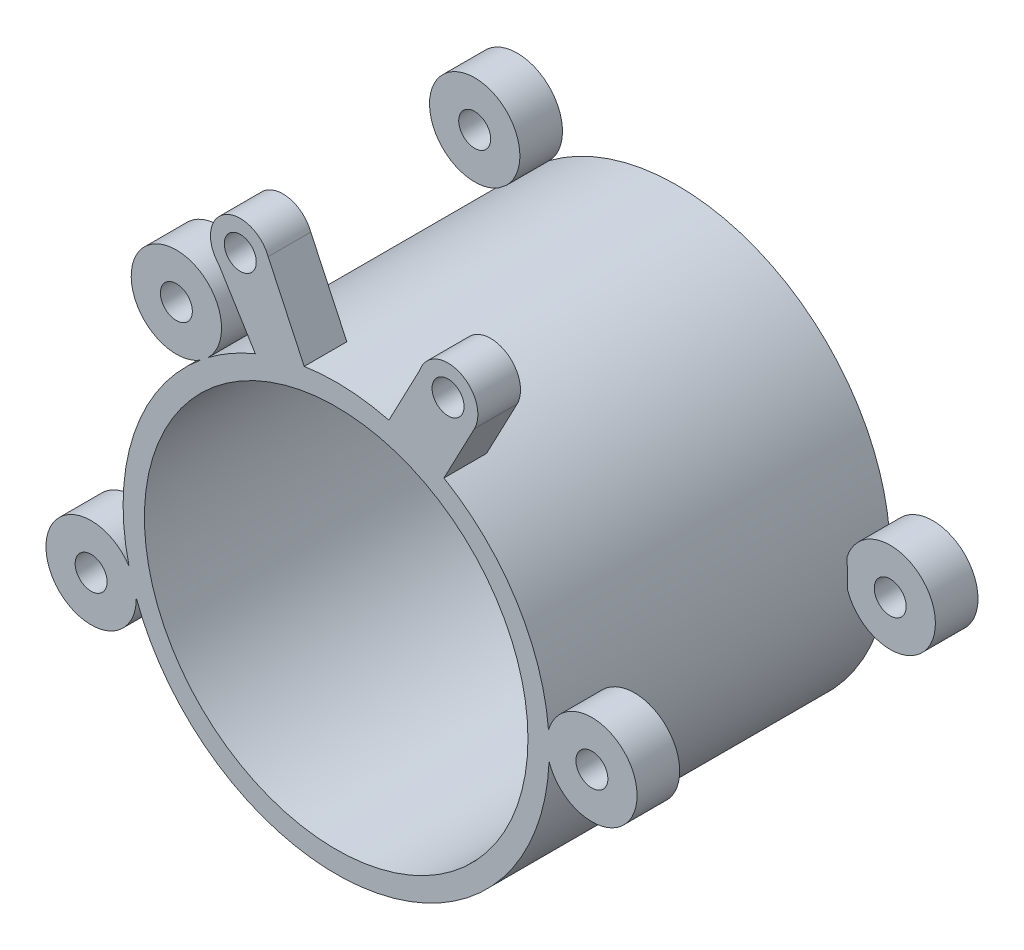
ISO-10303-21;
HEADER;
FILE_DESCRIPTION(('STEP AP214'),'2;1');
FILE_NAME('part.step','',(''),(''),'','','');
FILE_SCHEMA(('AUTOMOTIVE_DESIGN { 1 0 10303 214 1 1 1 1 }'));
ENDSEC;
DATA;
#1=APPLICATION_CONTEXT('core data for automotive mechanical design processes');
#2=APPLICATION_PROTOCOL_DEFINITION('international standard','automotive_design',2000,#1);
#3=PRODUCT_CONTEXT('',#1,'mechanical');
#4=PRODUCT('Part','Part','',(#3));
#5=PRODUCT_RELATED_PRODUCT_CATEGORY('part','',(#4));
#6=PRODUCT_DEFINITION_FORMATION('','',#4);
#7=PRODUCT_DEFINITION_CONTEXT('part definition',#1,'design');
#8=PRODUCT_DEFINITION('design','',#6,#7);
#9=PRODUCT_DEFINITION_SHAPE('','',#8);
#10=(LENGTH_UNIT() NAMED_UNIT(*) SI_UNIT(.MILLI.,.METRE.));
#11=(NAMED_UNIT(*) PLANE_ANGLE_UNIT() SI_UNIT($,.RADIAN.));
#12=(NAMED_UNIT(*) SI_UNIT($,.STERADIAN.) SOLID_ANGLE_UNIT());
#13=UNCERTAINTY_MEASURE_WITH_UNIT(LENGTH_MEASURE(1.E-05),#10,'distance_accuracy_value','');
#14=(GEOMETRIC_REPRESENTATION_CONTEXT(3) GLOBAL_UNCERTAINTY_ASSIGNED_CONTEXT((#13)) GLOBAL_UNIT_ASSIGNED_CONTEXT((#10,
#11,#12)) REPRESENTATION_CONTEXT('',''));
#15=CARTESIAN_POINT('',(0.,0.,0.));
#16=DIRECTION('',(0.,0.,1.));
#17=DIRECTION('',(1.,0.,0.));
#18=AXIS2_PLACEMENT_3D('',#15,#16,#17);
#19=CARTESIAN_POINT('',(33.3363184495412,76.2006218686625,38.1));
#20=DIRECTION('',(0.,0.,1.));
#21=DIRECTION('',(1.,0.,0.));
#22=AXIS2_PLACEMENT_3D('',#19,#20,#21);
#23=CYLINDRICAL_SURFACE('',#22,8.89);
#24=CARTESIAN_POINT('',(33.3363184495412,76.2006218686625,50.8));
#25=DIRECTION('',(0.,0.,1.));
#26=DIRECTION('',(1.,0.,0.));
#27=AXIS2_PLACEMENT_3D('',#24,#25,#26);
#28=CIRCLE('',#27,8.89);
#29=CARTESIAN_POINT('',(41.2032414465169,72.0601360807805,50.8));
#30=VERTEX_POINT('',#29);
#31=CARTESIAN_POINT('',(24.8861334689033,78.9622289719635,50.8));
#32=VERTEX_POINT('',#31);
#33=EDGE_CURVE('E295',#30,#32,#28,.T.);
#34=ORIENTED_EDGE('',*,*,#33,.F.);
#35=DIRECTION('',(0.,0.,1.));
#36=VECTOR('',#35,1.);
#37=CARTESIAN_POINT('',(41.2032414465169,72.0601360807805,0.));
#38=LINE('',#37,#36);
#39=CARTESIAN_POINT('',(41.2032414465169,72.0601360807805,38.1));
#40=VERTEX_POINT('',#39);
#41=EDGE_CURVE('E189',#40,#30,#38,.T.);
#42=ORIENTED_EDGE('',*,*,#41,.F.);
#43=CARTESIAN_POINT('',(33.3363184495412,76.2006218686625,38.1));
#44=DIRECTION('',(0.,0.,1.));
#45=DIRECTION('',(1.,0.,0.));
#46=AXIS2_PLACEMENT_3D('',#43,#44,#45);
#47=CIRCLE('',#46,8.89);
#48=CARTESIAN_POINT('',(24.8861334689033,78.9622289719635,38.1));
#49=VERTEX_POINT('',#48);
#50=EDGE_CURVE('E324',#49,#40,#47,.F.);
#51=ORIENTED_EDGE('',*,*,#50,.F.);
#52=DIRECTION('',(0.,0.,1.));
#53=VECTOR('',#52,1.);
#54=CARTESIAN_POINT('',(24.8861334689032,78.9622289719633,0.));
#55=LINE('',#54,#53);
#56=EDGE_CURVE('E185',#32,#49,#55,.F.);
#57=ORIENTED_EDGE('',*,*,#56,.F.);
#58=EDGE_LOOP('',(#34,#42,#51,#57));
#59=FACE_BOUND('',#58,.T.);
#60=ADVANCED_FACE('F17',(#59),#23,.T.);
#61=CARTESIAN_POINT('',(-28.575,82.55,38.1));
#62=DIRECTION('',(0.,0.,1.));
#63=DIRECTION('',(1.,0.,0.));
#64=AXIS2_PLACEMENT_3D('',#61,#62,#63);
#65=CYLINDRICAL_SURFACE('',#64,8.89);
#66=CARTESIAN_POINT('',(-28.575,82.55,50.8));
#67=DIRECTION('',(0.,0.,1.));
#68=DIRECTION('',(1.,0.,0.));
#69=AXIS2_PLACEMENT_3D('',#66,#67,#68);
#70=CIRCLE('',#69,8.89);
#71=CARTESIAN_POINT('',(-20.271297512555,85.7249999999999,50.8));
#72=VERTEX_POINT('',#71);
#73=CARTESIAN_POINT('',(-35.0570594181438,76.4660041338234,50.8));
#74=VERTEX_POINT('',#73);
#75=EDGE_CURVE('E291',#72,#74,#70,.T.);
#76=ORIENTED_EDGE('',*,*,#75,.F.);
#77=DIRECTION('',(0.,0.,1.));
#78=VECTOR('',#77,1.);
#79=CARTESIAN_POINT('',(-20.271297512555,85.725,0.));
#80=LINE('',#79,#78);
#81=CARTESIAN_POINT('',(-20.271297512555,85.7249999999999,38.1));
#82=VERTEX_POINT('',#81);
#83=EDGE_CURVE('E183',#82,#72,#80,.T.);
#84=ORIENTED_EDGE('',*,*,#83,.F.);
#85=CARTESIAN_POINT('',(-28.575,82.55,38.1));
#86=DIRECTION('',(0.,0.,1.));
#87=DIRECTION('',(1.,0.,0.));
#88=AXIS2_PLACEMENT_3D('',#85,#86,#87);
#89=CIRCLE('',#88,8.89);
#90=CARTESIAN_POINT('',(-35.0570594181438,76.4660041338234,38.1));
#91=VERTEX_POINT('',#90);
#92=EDGE_CURVE('E329',#91,#82,#89,.F.);
#93=ORIENTED_EDGE('',*,*,#92,.F.);
#94=DIRECTION('',(0.,0.,1.));
#95=VECTOR('',#94,1.);
#96=CARTESIAN_POINT('',(-35.0570594181438,76.4660041338235,0.));
#97=LINE('',#96,#95);
#98=EDGE_CURVE('E161',#74,#91,#97,.F.);
#99=ORIENTED_EDGE('',*,*,#98,.F.);
#100=EDGE_LOOP('',(#76,#84,#93,#99));
#101=FACE_BOUND('',#100,.T.);
#102=ADVANCED_FACE('F679',(#101),#65,.T.);
#103=CARTESIAN_POINT('',(-47.625,60.325,38.1));
#104=DIRECTION('',(0.,0.,1.));
#105=DIRECTION('',(0.,-1.,0.));
#106=AXIS2_PLACEMENT_3D('',#103,#104,#105);
#107=CYLINDRICAL_SURFACE('',#106,4.7625);
#108=CARTESIAN_POINT('',(-47.625,60.325,38.1));
#109=DIRECTION('',(0.,0.,1.));
#110=DIRECTION('',(0.,-1.,0.));
#111=AXIS2_PLACEMENT_3D('',#108,#109,#110);
#112=CIRCLE('',#111,4.7625);
#113=CARTESIAN_POINT('',(-47.625,55.5625,38.1));
#114=VERTEX_POINT('',#113);
#115=EDGE_CURVE('E20',#114,#114,#112,.T.);
#116=ORIENTED_EDGE('',*,*,#115,.F.);
#117=EDGE_LOOP('',(#116));
#118=FACE_BOUND('',#117,.T.);
#119=CARTESIAN_POINT('',(-47.625,60.325,50.8));
#120=DIRECTION('',(0.,0.,1.));
#121=DIRECTION('',(0.,-1.,0.));
#122=AXIS2_PLACEMENT_3D('',#119,#120,#121);
#123=CIRCLE('',#122,4.7625);
#124=CARTESIAN_POINT('',(-47.625,55.5625,50.8));
#125=VERTEX_POINT('',#124);
#126=EDGE_CURVE('E284',#125,#125,#123,.F.);
#127=ORIENTED_EDGE('',*,*,#126,.F.);
#128=EDGE_LOOP('',(#127));
#129=FACE_BOUND('',#128,.T.);
#130=ADVANCED_FACE('F670',(#118,#129),#107,.F.);
#131=CARTESIAN_POINT('',(-73.025,-22.225,38.1));
#132=DIRECTION('',(0.,0.,1.));
#133=DIRECTION('',(0.,-1.,0.));
#134=AXIS2_PLACEMENT_3D('',#131,#132,#133);
#135=CYLINDRICAL_SURFACE('',#134,4.76250000000002);
#136=CARTESIAN_POINT('',(-73.025,-22.225,38.1));
#137=DIRECTION('',(0.,0.,1.));
#138=DIRECTION('',(0.,-1.,0.));
#139=AXIS2_PLACEMENT_3D('',#136,#137,#138);
#140=CIRCLE('',#139,4.76250000000002);
#141=CARTESIAN_POINT('',(-73.025,-26.9875,38.1));
#142=VERTEX_POINT('',#141);
#143=EDGE_CURVE('E308',#142,#142,#140,.T.);
#144=ORIENTED_EDGE('',*,*,#143,.F.);
#145=EDGE_LOOP('',(#144));
#146=FACE_BOUND('',#145,.T.);
#147=CARTESIAN_POINT('',(-73.025,-22.225,50.8));
#148=DIRECTION('',(0.,0.,1.));
#149=DIRECTION('',(0.,-1.,0.));
#150=AXIS2_PLACEMENT_3D('',#147,#148,#149);
#151=CIRCLE('',#150,4.76250000000002);
#152=CARTESIAN_POINT('',(-73.025,-26.9875,50.8));
#153=VERTEX_POINT('',#152);
#154=EDGE_CURVE('E281',#153,#153,#151,.F.);
#155=ORIENTED_EDGE('',*,*,#154,.F.);
#156=EDGE_LOOP('',(#155));
#157=FACE_BOUND('',#156,.T.);
#158=ADVANCED_FACE('F661',(#146,#157),#135,.F.);
#159=CARTESIAN_POINT('',(76.2,1.5875,38.1));
#160=DIRECTION('',(0.,0.,1.));
#161=DIRECTION('',(0.,-1.,0.));
#162=AXIS2_PLACEMENT_3D('',#159,#160,#161);
#163=CYLINDRICAL_SURFACE('',#162,4.7625);
#164=CARTESIAN_POINT('',(76.2,1.5875,38.1));
#165=DIRECTION('',(0.,0.,1.));
#166=DIRECTION('',(0.,-1.,0.));
#167=AXIS2_PLACEMENT_3D('',#164,#165,#166);
#168=CIRCLE('',#167,4.7625);
#169=CARTESIAN_POINT('',(76.2,-3.175,38.1));
#170=VERTEX_POINT('',#169);
#171=EDGE_CURVE('E314',#170,#170,#168,.T.);
#172=ORIENTED_EDGE('',*,*,#171,.F.);
#173=EDGE_LOOP('',(#172));
#174=FACE_BOUND('',#173,.T.);
#175=CARTESIAN_POINT('',(76.2,1.58749999999999,50.8));
#176=DIRECTION('',(0.,0.,1.));
#177=DIRECTION('',(0.,-1.,0.));
#178=AXIS2_PLACEMENT_3D('',#175,#176,#177);
#179=CIRCLE('',#178,4.7625);
#180=CARTESIAN_POINT('',(76.2,-3.17500000000001,50.8));
#181=VERTEX_POINT('',#180);
#182=EDGE_CURVE('E278',#181,#181,#179,.F.);
#183=ORIENTED_EDGE('',*,*,#182,.F.);
#184=EDGE_LOOP('',(#183));
#185=FACE_BOUND('',#184,.T.);
#186=ADVANCED_FACE('F652',(#174,#185),#163,.F.);
#187=CARTESIAN_POINT('',(-28.575,82.55,38.1));
#188=DIRECTION('',(0.,0.,1.));
#189=DIRECTION('',(0.,-1.,0.));
#190=AXIS2_PLACEMENT_3D('',#187,#188,#189);
#191=CYLINDRICAL_SURFACE('',#190,4.7625);
#192=CARTESIAN_POINT('',(-28.575,82.55,38.1));
#193=DIRECTION('',(0.,0.,1.));
#194=DIRECTION('',(0.,-1.,0.));
#195=AXIS2_PLACEMENT_3D('',#192,#193,#194);
#196=CIRCLE('',#195,4.7625);
#197=CARTESIAN_POINT('',(-28.575,77.7875,38.1));
#198=VERTEX_POINT('',#197);
#199=EDGE_CURVE('E326',#198,#198,#196,.T.);
#200=ORIENTED_EDGE('',*,*,#199,.F.);
#201=EDGE_LOOP('',(#200));
#202=FACE_BOUND('',#201,.T.);
#203=CARTESIAN_POINT('',(-28.575,82.55,50.8));
#204=DIRECTION('',(0.,0.,1.));
#205=DIRECTION('',(0.,-1.,0.));
#206=AXIS2_PLACEMENT_3D('',#203,#204,#205);
#207=CIRCLE('',#206,4.7625);
#208=CARTESIAN_POINT('',(-28.575,77.7875,50.8));
#209=VERTEX_POINT('',#208);
#210=EDGE_CURVE('E275',#209,#209,#207,.F.);
#211=ORIENTED_EDGE('',*,*,#210,.F.);
#212=EDGE_LOOP('',(#211));
#213=FACE_BOUND('',#212,.T.);
#214=ADVANCED_FACE('F404',(#202,#213),#191,.F.);
#215=CARTESIAN_POINT('',(33.3363184495412,76.2006218686625,38.1));
#216=DIRECTION('',(0.,0.,1.));
#217=DIRECTION('',(0.,-1.,0.));
#218=AXIS2_PLACEMENT_3D('',#215,#216,#217);
#219=CYLINDRICAL_SURFACE('',#218,4.7625);
#220=CARTESIAN_POINT('',(33.3363184495412,76.2006218686625,38.1));
#221=DIRECTION('',(0.,0.,1.));
#222=DIRECTION('',(0.,-1.,0.));
#223=AXIS2_PLACEMENT_3D('',#220,#221,#222);
#224=CIRCLE('',#223,4.7625);
#225=CARTESIAN_POINT('',(33.3363184495412,71.4381218686625,38.1));
#226=VERTEX_POINT('',#225);
#227=EDGE_CURVE('E321',#226,#226,#224,.T.);
#228=ORIENTED_EDGE('',*,*,#227,.F.);
#229=EDGE_LOOP('',(#228));
#230=FACE_BOUND('',#229,.T.);
#231=CARTESIAN_POINT('',(33.3363184495412,76.2006218686625,50.8));
#232=DIRECTION('',(0.,0.,1.));
#233=DIRECTION('',(0.,-1.,0.));
#234=AXIS2_PLACEMENT_3D('',#231,#232,#233);
#235=CIRCLE('',#234,4.7625);
#236=CARTESIAN_POINT('',(33.3363184495412,71.4381218686625,50.8));
#237=VERTEX_POINT('',#236);
#238=EDGE_CURVE('E272',#237,#237,#235,.F.);
#239=ORIENTED_EDGE('',*,*,#238,.F.);
#240=EDGE_LOOP('',(#239));
#241=FACE_BOUND('',#240,.T.);
#242=ADVANCED_FACE('F394',(#230,#241),#219,.F.);
#243=CARTESIAN_POINT('',(-46.8650600428967,59.362409387669,-38.1));
#244=DIRECTION('',(0.,0.,1.));
#245=DIRECTION('',(1.,0.,0.));
#246=AXIS2_PLACEMENT_3D('',#243,#244,#245);
#247=PLANE('',#246);
#248=CARTESIAN_POINT('',(-47.625,60.325,-38.1));
#249=DIRECTION('',(0.,0.,1.));
#250=DIRECTION('',(1.,0.,0.));
#251=AXIS2_PLACEMENT_3D('',#248,#249,#250);
#252=CIRCLE('',#251,4.7625);
#253=CARTESIAN_POINT('',(-42.8625,60.325,-38.1));
#254=VERTEX_POINT('',#253);
#255=EDGE_CURVE('E317',#254,#254,#252,.T.);
#256=ORIENTED_EDGE('',*,*,#255,.F.);
#257=EDGE_LOOP('',(#256));
#258=FACE_BOUND('',#257,.T.);
#259=CARTESIAN_POINT('',(0.,0.,-38.1));
#260=DIRECTION('',(0.,0.,1.));
#261=DIRECTION('',(1.,0.,0.));
#262=AXIS2_PLACEMENT_3D('',#259,#260,#261);
#263=CIRCLE('',#262,63.5);
#264=CARTESIAN_POINT('',(-38.148323771396,50.7637212331084,-38.1));
#265=VERTEX_POINT('',#264);
#266=CARTESIAN_POINT('',(-40.5241451705835,48.8880727600657,-38.1));
#267=VERTEX_POINT('',#266);
#268=EDGE_CURVE('E176',#265,#267,#263,.T.);
#269=ORIENTED_EDGE('',*,*,#268,.F.);
#270=CARTESIAN_POINT('',(-47.625,60.325,-38.1));
#271=DIRECTION('',(0.,0.,1.));
#272=DIRECTION('',(1.,0.,0.));
#273=AXIS2_PLACEMENT_3D('',#270,#271,#272);
#274=CIRCLE('',#273,13.462);
#275=EDGE_CURVE('E190',#267,#265,#274,.F.);
#276=ORIENTED_EDGE('',*,*,#275,.F.);
#277=EDGE_LOOP('',(#269,#276));
#278=FACE_BOUND('',#277,.T.);
#279=ADVANCED_FACE('F392',(#258,#278),#247,.T.);
#280=CARTESIAN_POINT('',(-46.8650600428967,59.362409387669,38.1));
#281=DIRECTION('',(0.,0.,-1.));
#282=DIRECTION('',(-1.,0.,0.));
#283=AXIS2_PLACEMENT_3D('',#280,#281,#282);
#284=PLANE('',#283);
#285=ORIENTED_EDGE('',*,*,#115,.T.);
#286=EDGE_LOOP('',(#285));
#287=FACE_BOUND('',#286,.T.);
#288=CARTESIAN_POINT('',(0.,0.,38.1));
#289=DIRECTION('',(0.,0.,1.));
#290=DIRECTION('',(1.,0.,0.));
#291=AXIS2_PLACEMENT_3D('',#288,#289,#290);
#292=CIRCLE('',#291,63.5);
#293=CARTESIAN_POINT('',(-40.5241451705835,48.8880727600657,38.1));
#294=VERTEX_POINT('',#293);
#295=CARTESIAN_POINT('',(-38.148323771396,50.7637212331084,38.1));
#296=VERTEX_POINT('',#295);
#297=EDGE_CURVE('E162',#294,#296,#292,.F.);
#298=ORIENTED_EDGE('',*,*,#297,.F.);
#299=CARTESIAN_POINT('',(-47.625,60.325,38.1));
#300=DIRECTION('',(0.,0.,1.));
#301=DIRECTION('',(1.,0.,0.));
#302=AXIS2_PLACEMENT_3D('',#299,#300,#301);
#303=CIRCLE('',#302,13.462);
#304=EDGE_CURVE('E151',#296,#294,#303,.T.);
#305=ORIENTED_EDGE('',*,*,#304,.F.);
#306=EDGE_LOOP('',(#298,#305));
#307=FACE_BOUND('',#306,.T.);
#308=ADVANCED_FACE('F163',(#287,#307),#284,.T.);
#309=CARTESIAN_POINT('',(-47.625,60.325,38.1));
#310=DIRECTION('',(0.,0.,1.));
#311=DIRECTION('',(1.,0.,0.));
#312=AXIS2_PLACEMENT_3D('',#309,#310,#311);
#313=CYLINDRICAL_SURFACE('',#312,13.462);
#314=CARTESIAN_POINT('',(-47.625,60.325,50.8));
#315=DIRECTION('',(0.,0.,1.));
#316=DIRECTION('',(1.,0.,0.));
#317=AXIS2_PLACEMENT_3D('',#314,#315,#316);
#318=CIRCLE('',#317,13.462);
#319=CARTESIAN_POINT('',(-38.148323771396,50.7637212331084,50.8));
#320=VERTEX_POINT('',#319);
#321=CARTESIAN_POINT('',(-40.5241451705835,48.8880727600657,50.8));
#322=VERTEX_POINT('',#321);
#323=EDGE_CURVE('E304',#320,#322,#318,.T.);
#324=ORIENTED_EDGE('',*,*,#323,.F.);
#325=DIRECTION('',(0.,0.,1.));
#326=VECTOR('',#325,1.);
#327=CARTESIAN_POINT('',(-38.1483237713962,50.7637212331083,0.));
#328=LINE('',#327,#326);
#329=EDGE_CURVE('E159',#296,#320,#328,.T.);
#330=ORIENTED_EDGE('',*,*,#329,.F.);
#331=ORIENTED_EDGE('',*,*,#304,.T.);
#332=DIRECTION('',(0.,0.,1.));
#333=VECTOR('',#332,1.);
#334=CARTESIAN_POINT('',(-40.5241451705834,48.8880727600658,0.));
#335=LINE('',#334,#333);
#336=EDGE_CURVE('E157',#322,#294,#335,.F.);
#337=ORIENTED_EDGE('',*,*,#336,.F.);
#338=EDGE_LOOP('',(#324,#330,#331,#337));
#339=FACE_BOUND('',#338,.T.);
#340=ADVANCED_FACE('F155',(#339),#313,.T.);
#341=CARTESIAN_POINT('',(-24.0887628718301,58.7535658773554,0.));
#342=DIRECTION('',(-0.850190944007787,-0.526474461609629,0.));
#343=DIRECTION('',(0.526474461609629,-0.850190944007787,0.));
#344=AXIS2_PLACEMENT_3D('',#341,#342,#343);
#345=PLANE('',#344);
#346=DIRECTION('',(0.526474461609626,-0.850190944007788,0.));
#347=VECTOR('',#346,1.);
#348=CARTESIAN_POINT('',(-35.0570594181438,76.4660041338235,50.8));
#349=LINE('',#348,#347);
#350=CARTESIAN_POINT('',(-24.0887628718301,58.7535658773554,50.8));
#351=VERTEX_POINT('',#350);
#352=EDGE_CURVE('E290',#74,#351,#349,.T.);
#353=ORIENTED_EDGE('',*,*,#352,.F.);
#354=ORIENTED_EDGE('',*,*,#98,.T.);
#355=DIRECTION('',(-0.526474461609627,0.850190944007788,0.));
#356=VECTOR('',#355,1.);
#357=CARTESIAN_POINT('',(-24.0887628718301,58.7535658773554,38.1));
#358=LINE('',#357,#356);
#359=CARTESIAN_POINT('',(-24.0887628718301,58.7535658773554,38.1));
#360=VERTEX_POINT('',#359);
#361=EDGE_CURVE('E182',#360,#91,#358,.T.);
#362=ORIENTED_EDGE('',*,*,#361,.F.);
#363=DIRECTION('',(0.,0.,1.));
#364=VECTOR('',#363,1.);
#365=CARTESIAN_POINT('',(-24.0887628718301,58.7535658773554,0.));
#366=LINE('',#365,#364);
#367=EDGE_CURVE('E265',#351,#360,#366,.F.);
#368=ORIENTED_EDGE('',*,*,#367,.F.);
#369=EDGE_LOOP('',(#353,#354,#362,#368));
#370=FACE_BOUND('',#369,.T.);
#371=ADVANCED_FACE('F344',(#370),#345,.T.);
#372=CARTESIAN_POINT('',(-23.9209762226179,74.6390398293391,38.1));
#373=DIRECTION('',(0.,0.,-1.));
#374=DIRECTION('',(-1.,0.,0.));
#375=AXIS2_PLACEMENT_3D('',#372,#373,#374);
#376=PLANE('',#375);
#377=ORIENTED_EDGE('',*,*,#199,.T.);
#378=EDGE_LOOP('',(#377));
#379=FACE_BOUND('',#378,.T.);
#380=DIRECTION('',(-0.42416075049353,0.905586913410726,0.));
#381=VECTOR('',#380,1.);
#382=CARTESIAN_POINT('',(-20.271297512555,85.725,38.1));
#383=LINE('',#382,#381);
#384=CARTESIAN_POINT('',(-9.52500000000001,62.7815607881805,38.1));
#385=VERTEX_POINT('',#384);
#386=EDGE_CURVE('E186',#385,#82,#383,.T.);
#387=ORIENTED_EDGE('',*,*,#386,.F.);
#388=CARTESIAN_POINT('',(0.,0.,38.1));
#389=DIRECTION('',(0.,0.,1.));
#390=DIRECTION('',(1.,0.,0.));
#391=AXIS2_PLACEMENT_3D('',#388,#389,#390);
#392=CIRCLE('',#391,63.5);
#393=EDGE_CURVE('E262',#360,#385,#392,.F.);
#394=ORIENTED_EDGE('',*,*,#393,.F.);
#395=ORIENTED_EDGE('',*,*,#361,.T.);
#396=ORIENTED_EDGE('',*,*,#92,.T.);
#397=EDGE_LOOP('',(#387,#394,#395,#396));
#398=FACE_BOUND('',#397,.T.);
#399=ADVANCED_FACE('F345',(#379,#398),#376,.T.);
#400=CARTESIAN_POINT('',(-20.271297512555,85.725,0.));
#401=DIRECTION('',(0.905586913410726,0.42416075049353,0.));
#402=DIRECTION('',(-0.42416075049353,0.905586913410726,0.));
#403=AXIS2_PLACEMENT_3D('',#400,#401,#402);
#404=PLANE('',#403);
#405=DIRECTION('',(-0.424160750493531,0.905586913410725,0.));
#406=VECTOR('',#405,1.);
#407=CARTESIAN_POINT('',(-9.525,62.7815607881805,50.8));
#408=LINE('',#407,#406);
#409=CARTESIAN_POINT('',(-9.52499999999998,62.7815607881805,50.8));
#410=VERTEX_POINT('',#409);
#411=EDGE_CURVE('E294',#410,#72,#408,.T.);
#412=ORIENTED_EDGE('',*,*,#411,.F.);
#413=DIRECTION('',(0.,0.,1.));
#414=VECTOR('',#413,1.);
#415=CARTESIAN_POINT('',(-9.52499999999999,62.7815607881805,0.));
#416=LINE('',#415,#414);
#417=EDGE_CURVE('E261',#385,#410,#416,.T.);
#418=ORIENTED_EDGE('',*,*,#417,.F.);
#419=ORIENTED_EDGE('',*,*,#386,.T.);
#420=ORIENTED_EDGE('',*,*,#83,.T.);
#421=EDGE_LOOP('',(#412,#418,#419,#420));
#422=FACE_BOUND('',#421,.T.);
#423=ADVANCED_FACE('F349',(#422),#404,.T.);
#424=CARTESIAN_POINT('',(15.7092586107543,61.5261667414804,0.));
#425=DIRECTION('',(-0.884918222381982,0.465746432832623,0.));
#426=DIRECTION('',(-0.465746432832623,-0.884918222381982,0.));
#427=AXIS2_PLACEMENT_3D('',#424,#425,#426);
#428=PLANE('',#427);
#429=DIRECTION('',(-0.465746432832621,-0.884918222381983,0.));
#430=VECTOR('',#429,1.);
#431=CARTESIAN_POINT('',(24.8861334689032,78.9622289719633,50.8));
#432=LINE('',#431,#430);
#433=CARTESIAN_POINT('',(15.7092586107543,61.5261667414804,50.8));
#434=VERTEX_POINT('',#433);
#435=EDGE_CURVE('E298',#32,#434,#432,.T.);
#436=ORIENTED_EDGE('',*,*,#435,.F.);
#437=ORIENTED_EDGE('',*,*,#56,.T.);
#438=DIRECTION('',(0.465746432832621,0.884918222381983,0.));
#439=VECTOR('',#438,1.);
#440=CARTESIAN_POINT('',(15.7092586107543,61.5261667414804,38.1));
#441=LINE('',#440,#439);
#442=CARTESIAN_POINT('',(15.7092586107543,61.5261667414804,38.1));
#443=VERTEX_POINT('',#442);
#444=EDGE_CURVE('E188',#443,#49,#441,.T.);
#445=ORIENTED_EDGE('',*,*,#444,.F.);
#446=DIRECTION('',(0.,0.,1.));
#447=VECTOR('',#446,1.);
#448=CARTESIAN_POINT('',(15.7092586107543,61.5261667414804,0.));
#449=LINE('',#448,#447);
#450=EDGE_CURVE('E257',#434,#443,#449,.F.);
#451=ORIENTED_EDGE('',*,*,#450,.F.);
#452=EDGE_LOOP('',(#436,#437,#445,#451));
#453=FACE_BOUND('',#452,.T.);
#454=ADVANCED_FACE('F475',(#453),#428,.T.);
#455=CARTESIAN_POINT('',(29.8338336588176,69.8041145528211,38.1));
#456=DIRECTION('',(0.,0.,-1.));
#457=DIRECTION('',(-1.,0.,0.));
#458=AXIS2_PLACEMENT_3D('',#455,#456,#457);
#459=PLANE('',#458);
#460=ORIENTED_EDGE('',*,*,#227,.T.);
#461=EDGE_LOOP('',(#460));
#462=FACE_BOUND('',#461,.T.);
#463=DIRECTION('',(0.465746432832622,0.884918222381983,0.));
#464=VECTOR('',#463,1.);
#465=CARTESIAN_POINT('',(41.2032414465169,72.0601360807805,38.1));
#466=LINE('',#465,#464);
#467=CARTESIAN_POINT('',(32.1100855174925,54.7831398156341,38.1));
#468=VERTEX_POINT('',#467);
#469=EDGE_CURVE('E191',#468,#40,#466,.T.);
#470=ORIENTED_EDGE('',*,*,#469,.F.);
#471=CARTESIAN_POINT('',(0.,0.,38.1));
#472=DIRECTION('',(0.,0.,1.));
#473=DIRECTION('',(1.,0.,0.));
#474=AXIS2_PLACEMENT_3D('',#471,#472,#473);
#475=CIRCLE('',#474,63.5);
#476=EDGE_CURVE('E254',#443,#468,#475,.F.);
#477=ORIENTED_EDGE('',*,*,#476,.F.);
#478=ORIENTED_EDGE('',*,*,#444,.T.);
#479=ORIENTED_EDGE('',*,*,#50,.T.);
#480=EDGE_LOOP('',(#470,#477,#478,#479));
#481=FACE_BOUND('',#480,.T.);
#482=ADVANCED_FACE('F471',(#462,#481),#459,.T.);
#483=CARTESIAN_POINT('',(41.2032414465169,72.0601360807805,0.));
#484=DIRECTION('',(0.884918222381983,-0.465746432832622,0.));
#485=DIRECTION('',(0.465746432832622,0.884918222381983,0.));
#486=AXIS2_PLACEMENT_3D('',#483,#484,#485);
#487=PLANE('',#486);
#488=DIRECTION('',(0.465746432832621,0.884918222381983,0.));
#489=VECTOR('',#488,1.);
#490=CARTESIAN_POINT('',(32.1100855174925,54.7831398156341,50.8));
#491=LINE('',#490,#489);
#492=CARTESIAN_POINT('',(32.1100855174925,54.7831398156341,50.8));
#493=VERTEX_POINT('',#492);
#494=EDGE_CURVE('E299',#493,#30,#491,.T.);
#495=ORIENTED_EDGE('',*,*,#494,.F.);
#496=DIRECTION('',(0.,0.,1.));
#497=VECTOR('',#496,1.);
#498=CARTESIAN_POINT('',(32.1100855174925,54.7831398156341,0.));
#499=LINE('',#498,#497);
#500=EDGE_CURVE('E253',#468,#493,#499,.T.);
#501=ORIENTED_EDGE('',*,*,#500,.F.);
#502=ORIENTED_EDGE('',*,*,#469,.T.);
#503=ORIENTED_EDGE('',*,*,#41,.T.);
#504=EDGE_LOOP('',(#495,#501,#502,#503));
#505=FACE_BOUND('',#504,.T.);
#506=ADVANCED_FACE('F468',(#505),#487,.T.);
#507=CARTESIAN_POINT('',(-47.625,60.325,-50.8));
#508=DIRECTION('',(0.,0.,1.));
#509=DIRECTION('',(1.,0.,0.));
#510=AXIS2_PLACEMENT_3D('',#507,#508,#509);
#511=CYLINDRICAL_SURFACE('',#510,13.462);
#512=CARTESIAN_POINT('',(-47.625,60.325,-50.8));
#513=DIRECTION('',(0.,0.,1.));
#514=DIRECTION('',(1.,0.,0.));
#515=AXIS2_PLACEMENT_3D('',#512,#513,#514);
#516=CIRCLE('',#515,13.462);
#517=CARTESIAN_POINT('',(-40.5241451705835,48.8880727600657,-50.8));
#518=VERTEX_POINT('',#517);
#519=CARTESIAN_POINT('',(-38.1483237713959,50.7637212331085,-50.8));
#520=VERTEX_POINT('',#519);
#521=EDGE_CURVE('E237',#518,#520,#516,.F.);
#522=ORIENTED_EDGE('',*,*,#521,.F.);
#523=DIRECTION('',(0.,0.,1.));
#524=VECTOR('',#523,1.);
#525=CARTESIAN_POINT('',(-40.5241451705834,48.8880727600658,0.));
#526=LINE('',#525,#524);
#527=EDGE_CURVE('E173',#267,#518,#526,.F.);
#528=ORIENTED_EDGE('',*,*,#527,.F.);
#529=ORIENTED_EDGE('',*,*,#275,.T.);
#530=DIRECTION('',(0.,0.,1.));
#531=VECTOR('',#530,1.);
#532=CARTESIAN_POINT('',(-38.1483237713962,50.7637212331083,0.));
#533=LINE('',#532,#531);
#534=EDGE_CURVE('E271',#520,#265,#533,.T.);
#535=ORIENTED_EDGE('',*,*,#534,.F.);
#536=EDGE_LOOP('',(#522,#528,#529,#535));
#537=FACE_BOUND('',#536,.T.);
#538=ADVANCED_FACE('F389',(#537),#511,.T.);
#539=CARTESIAN_POINT('',(0.,0.,-50.8));
#540=DIRECTION('',(0.,0.,1.));
#541=DIRECTION('',(1.,0.,0.));
#542=AXIS2_PLACEMENT_3D('',#539,#540,#541);
#543=CYLINDRICAL_SURFACE('',#542,57.15);
#544=CARTESIAN_POINT('',(0.,0.,50.8));
#545=DIRECTION('',(0.,0.,1.));
#546=DIRECTION('',(1.,0.,0.));
#547=AXIS2_PLACEMENT_3D('',#544,#545,#546);
#548=CIRCLE('',#547,57.15);
#549=CARTESIAN_POINT('',(57.15,0.,50.8));
#550=VERTEX_POINT('',#549);
#551=EDGE_CURVE('E287',#550,#550,#548,.F.);
#552=ORIENTED_EDGE('',*,*,#551,.F.);
#553=EDGE_LOOP('',(#552));
#554=FACE_BOUND('',#553,.T.);
#555=CARTESIAN_POINT('',(0.,0.,-50.8));
#556=DIRECTION('',(0.,0.,1.));
#557=DIRECTION('',(1.,0.,0.));
#558=AXIS2_PLACEMENT_3D('',#555,#556,#557);
#559=CIRCLE('',#558,57.15);
#560=CARTESIAN_POINT('',(57.15,0.,-50.8));
#561=VERTEX_POINT('',#560);
#562=EDGE_CURVE('E234',#561,#561,#559,.T.);
#563=ORIENTED_EDGE('',*,*,#562,.F.);
#564=EDGE_LOOP('',(#563));
#565=FACE_BOUND('',#564,.T.);
#566=ADVANCED_FACE('F461',(#554,#565),#543,.F.);
#567=CARTESIAN_POINT('',(-47.625,60.325,-50.8));
#568=DIRECTION('',(0.,0.,1.));
#569=DIRECTION('',(1.,0.,0.));
#570=AXIS2_PLACEMENT_3D('',#567,#568,#569);
#571=CYLINDRICAL_SURFACE('',#570,4.7625);
#572=ORIENTED_EDGE('',*,*,#255,.T.);
#573=EDGE_LOOP('',(#572));
#574=FACE_BOUND('',#573,.T.);
#575=CARTESIAN_POINT('',(-47.625,60.325,-50.8));
#576=DIRECTION('',(0.,0.,1.));
#577=DIRECTION('',(1.,0.,0.));
#578=AXIS2_PLACEMENT_3D('',#575,#576,#577);
#579=CIRCLE('',#578,4.7625);
#580=CARTESIAN_POINT('',(-42.8625,60.325,-50.8));
#581=VERTEX_POINT('',#580);
#582=EDGE_CURVE('E231',#581,#581,#579,.T.);
#583=ORIENTED_EDGE('',*,*,#582,.F.);
#584=EDGE_LOOP('',(#583));
#585=FACE_BOUND('',#584,.T.);
#586=ADVANCED_FACE('F457',(#574,#585),#571,.F.);
#587=CARTESIAN_POINT('',(-73.025,-22.225,-50.8));
#588=DIRECTION('',(0.,0.,1.));
#589=DIRECTION('',(1.,0.,0.));
#590=AXIS2_PLACEMENT_3D('',#587,#588,#589);
#591=CYLINDRICAL_SURFACE('',#590,4.76250000000002);
#592=CARTESIAN_POINT('',(-73.025,-22.225,-38.1));
#593=DIRECTION('',(0.,0.,1.));
#594=DIRECTION('',(1.,0.,0.));
#595=AXIS2_PLACEMENT_3D('',#592,#593,#594);
#596=CIRCLE('',#595,4.76250000000002);
#597=CARTESIAN_POINT('',(-68.2625,-22.225,-38.1));
#598=VERTEX_POINT('',#597);
#599=EDGE_CURVE('E246',#598,#598,#596,.F.);
#600=ORIENTED_EDGE('',*,*,#599,.F.);
#601=EDGE_LOOP('',(#600));
#602=FACE_BOUND('',#601,.T.);
#603=CARTESIAN_POINT('',(-73.025,-22.225,-50.8));
#604=DIRECTION('',(0.,0.,1.));
#605=DIRECTION('',(1.,0.,0.));
#606=AXIS2_PLACEMENT_3D('',#603,#604,#605);
#607=CIRCLE('',#606,4.76250000000002);
#608=CARTESIAN_POINT('',(-68.2625,-22.225,-50.8));
#609=VERTEX_POINT('',#608);
#610=EDGE_CURVE('E228',#609,#609,#607,.T.);
#611=ORIENTED_EDGE('',*,*,#610,.F.);
#612=EDGE_LOOP('',(#611));
#613=FACE_BOUND('',#612,.T.);
#614=ADVANCED_FACE('F453',(#602,#613),#591,.F.);
#615=CARTESIAN_POINT('',(76.2,1.5875,-50.8));
#616=DIRECTION('',(0.,0.,1.));
#617=DIRECTION('',(1.,0.,0.));
#618=AXIS2_PLACEMENT_3D('',#615,#616,#617);
#619=CYLINDRICAL_SURFACE('',#618,4.7625);
#620=CARTESIAN_POINT('',(76.2,1.5875,-38.1));
#621=DIRECTION('',(0.,0.,1.));
#622=DIRECTION('',(1.,0.,0.));
#623=AXIS2_PLACEMENT_3D('',#620,#621,#622);
#624=CIRCLE('',#623,4.7625);
#625=CARTESIAN_POINT('',(80.9625,1.5875,-38.1));
#626=VERTEX_POINT('',#625);
#627=EDGE_CURVE('E217',#626,#626,#624,.F.);
#628=ORIENTED_EDGE('',*,*,#627,.F.);
#629=EDGE_LOOP('',(#628));
#630=FACE_BOUND('',#629,.T.);
#631=CARTESIAN_POINT('',(76.2,1.5875,-50.8));
#632=DIRECTION('',(0.,0.,1.));
#633=DIRECTION('',(1.,0.,0.));
#634=AXIS2_PLACEMENT_3D('',#631,#632,#633);
#635=CIRCLE('',#634,4.7625);
#636=CARTESIAN_POINT('',(80.9625,1.5875,-50.8));
#637=VERTEX_POINT('',#636);
#638=EDGE_CURVE('E225',#637,#637,#635,.T.);
#639=ORIENTED_EDGE('',*,*,#638,.F.);
#640=EDGE_LOOP('',(#639));
#641=FACE_BOUND('',#640,.T.);
#642=ADVANCED_FACE('F449',(#630,#641),#619,.F.);
#643=CARTESIAN_POINT('',(75.0611967100589,1.56377493145956,38.1));
#644=DIRECTION('',(0.,0.,-1.));
#645=DIRECTION('',(-1.,0.,0.));
#646=AXIS2_PLACEMENT_3D('',#643,#644,#645);
#647=PLANE('',#646);
#648=ORIENTED_EDGE('',*,*,#171,.T.);
#649=EDGE_LOOP('',(#648));
#650=FACE_BOUND('',#649,.T.);
#651=CARTESIAN_POINT('',(0.,0.,38.1));
#652=DIRECTION('',(0.,0.,1.));
#653=DIRECTION('',(1.,0.,0.));
#654=AXIS2_PLACEMENT_3D('',#651,#652,#653);
#655=CIRCLE('',#654,63.5);
#656=CARTESIAN_POINT('',(63.2742823536532,5.34931702464631,38.1));
#657=VERTEX_POINT('',#656);
#658=CARTESIAN_POINT('',(63.4421721018783,-2.70939089015606,38.1));
#659=VERTEX_POINT('',#658);
#660=EDGE_CURVE('E214',#657,#659,#655,.F.);
#661=ORIENTED_EDGE('',*,*,#660,.F.);
#662=CARTESIAN_POINT('',(76.2,1.5875,38.1));
#663=DIRECTION('',(0.,0.,1.));
#664=DIRECTION('',(1.,0.,0.));
#665=AXIS2_PLACEMENT_3D('',#662,#663,#664);
#666=CIRCLE('',#665,13.462);
#667=EDGE_CURVE('E311',#659,#657,#666,.T.);
#668=ORIENTED_EDGE('',*,*,#667,.F.);
#669=EDGE_LOOP('',(#661,#668));
#670=FACE_BOUND('',#669,.T.);
#671=ADVANCED_FACE('F445',(#650,#670),#647,.T.);
#672=CARTESIAN_POINT('',(76.2,1.5875,38.1));
#673=DIRECTION('',(0.,0.,1.));
#674=DIRECTION('',(1.,0.,0.));
#675=AXIS2_PLACEMENT_3D('',#672,#673,#674);
#676=CYLINDRICAL_SURFACE('',#675,13.462);
#677=CARTESIAN_POINT('',(76.2,1.5875,50.8));
#678=DIRECTION('',(0.,0.,1.));
#679=DIRECTION('',(1.,0.,0.));
#680=AXIS2_PLACEMENT_3D('',#677,#678,#679);
#681=CIRCLE('',#680,13.462);
#682=CARTESIAN_POINT('',(63.4421721018783,-2.70939089015606,50.8));
#683=VERTEX_POINT('',#682);
#684=CARTESIAN_POINT('',(63.2742823536532,5.34931702464631,50.8));
#685=VERTEX_POINT('',#684);
#686=EDGE_CURVE('E300',#683,#685,#681,.T.);
#687=ORIENTED_EDGE('',*,*,#686,.F.);
#688=DIRECTION('',(0.,0.,1.));
#689=VECTOR('',#688,1.);
#690=CARTESIAN_POINT('',(63.4421721018783,-2.709390890156,0.));
#691=LINE('',#690,#689);
#692=EDGE_CURVE('E213',#659,#683,#691,.T.);
#693=ORIENTED_EDGE('',*,*,#692,.F.);
#694=ORIENTED_EDGE('',*,*,#667,.T.);
#695=DIRECTION('',(0.,0.,1.));
#696=VECTOR('',#695,1.);
#697=CARTESIAN_POINT('',(63.2742823536532,5.34931702464626,0.));
#698=LINE('',#697,#696);
#699=EDGE_CURVE('E249',#685,#657,#698,.F.);
#700=ORIENTED_EDGE('',*,*,#699,.F.);
#701=EDGE_LOOP('',(#687,#693,#694,#700));
#702=FACE_BOUND('',#701,.T.);
#703=ADVANCED_FACE('F441',(#702),#676,.T.);
#704=CARTESIAN_POINT('',(-71.9160387214482,-21.8874900456582,38.1));
#705=DIRECTION('',(0.,0.,-1.));
#706=DIRECTION('',(-1.,0.,0.));
#707=AXIS2_PLACEMENT_3D('',#704,#705,#706);
#708=PLANE('',#707);
#709=ORIENTED_EDGE('',*,*,#143,.T.);
#710=EDGE_LOOP('',(#709));
#711=FACE_BOUND('',#710,.T.);
#712=CARTESIAN_POINT('',(-73.025,-22.225,38.1));
#713=DIRECTION('',(0.,0.,1.));
#714=DIRECTION('',(1.,0.,0.));
#715=AXIS2_PLACEMENT_3D('',#712,#713,#714);
#716=CIRCLE('',#715,13.462);
#717=CARTESIAN_POINT('',(-61.7252545960154,-14.9078148988064,38.1));
#718=VERTEX_POINT('',#717);
#719=CARTESIAN_POINT('',(-59.5647726704205,-22.0065412257611,38.1));
#720=VERTEX_POINT('',#719);
#721=EDGE_CURVE('E306',#718,#720,#716,.T.);
#722=ORIENTED_EDGE('',*,*,#721,.F.);
#723=CARTESIAN_POINT('',(0.,0.,38.1));
#724=DIRECTION('',(0.,0.,1.));
#725=DIRECTION('',(1.,0.,0.));
#726=AXIS2_PLACEMENT_3D('',#723,#724,#725);
#727=CIRCLE('',#726,63.5);
#728=EDGE_CURVE('E206',#720,#718,#727,.F.);
#729=ORIENTED_EDGE('',*,*,#728,.F.);
#730=EDGE_LOOP('',(#722,#729));
#731=FACE_BOUND('',#730,.T.);
#732=ADVANCED_FACE('F437',(#711,#731),#708,.T.);
#733=CARTESIAN_POINT('',(-73.025,-22.225,38.1));
#734=DIRECTION('',(0.,0.,1.));
#735=DIRECTION('',(1.,0.,0.));
#736=AXIS2_PLACEMENT_3D('',#733,#734,#735);
#737=CYLINDRICAL_SURFACE('',#736,13.462);
#738=CARTESIAN_POINT('',(-73.025,-22.225,50.8));
#739=DIRECTION('',(0.,0.,1.));
#740=DIRECTION('',(1.,0.,0.));
#741=AXIS2_PLACEMENT_3D('',#738,#739,#740);
#742=CIRCLE('',#741,13.462);
#743=CARTESIAN_POINT('',(-61.7252545960154,-14.9078148988064,50.8));
#744=VERTEX_POINT('',#743);
#745=CARTESIAN_POINT('',(-59.5647726704205,-22.0065412257611,50.8));
#746=VERTEX_POINT('',#745);
#747=EDGE_CURVE('E302',#744,#746,#742,.T.);
#748=ORIENTED_EDGE('',*,*,#747,.F.);
#749=DIRECTION('',(0.,0.,1.));
#750=VECTOR('',#749,1.);
#751=CARTESIAN_POINT('',(-61.7252545960154,-14.9078148988065,0.));
#752=LINE('',#751,#750);
#753=EDGE_CURVE('E205',#718,#744,#752,.T.);
#754=ORIENTED_EDGE('',*,*,#753,.F.);
#755=ORIENTED_EDGE('',*,*,#721,.T.);
#756=DIRECTION('',(0.,0.,1.));
#757=VECTOR('',#756,1.);
#758=CARTESIAN_POINT('',(-59.5647726704206,-22.006541225761,0.));
#759=LINE('',#758,#757);
#760=EDGE_CURVE('E209',#746,#720,#759,.F.);
#761=ORIENTED_EDGE('',*,*,#760,.F.);
#762=EDGE_LOOP('',(#748,#754,#755,#761));
#763=FACE_BOUND('',#762,.T.);
#764=ADVANCED_FACE('F433',(#763),#737,.T.);
#765=CARTESIAN_POINT('',(-46.8650600428967,59.362409387669,50.8));
#766=DIRECTION('',(0.,0.,1.));
#767=DIRECTION('',(1.,0.,0.));
#768=AXIS2_PLACEMENT_3D('',#765,#766,#767);
#769=PLANE('',#768);
#770=ORIENTED_EDGE('',*,*,#238,.T.);
#771=EDGE_LOOP('',(#770));
#772=FACE_BOUND('',#771,.T.);
#773=ORIENTED_EDGE('',*,*,#210,.T.);
#774=EDGE_LOOP('',(#773));
#775=FACE_BOUND('',#774,.T.);
#776=ORIENTED_EDGE('',*,*,#182,.T.);
#777=EDGE_LOOP('',(#776));
#778=FACE_BOUND('',#777,.T.);
#779=ORIENTED_EDGE('',*,*,#154,.T.);
#780=EDGE_LOOP('',(#779));
#781=FACE_BOUND('',#780,.T.);
#782=ORIENTED_EDGE('',*,*,#126,.T.);
#783=EDGE_LOOP('',(#782));
#784=FACE_BOUND('',#783,.T.);
#785=ORIENTED_EDGE('',*,*,#551,.T.);
#786=EDGE_LOOP('',(#785));
#787=FACE_BOUND('',#786,.T.);
#788=ORIENTED_EDGE('',*,*,#352,.T.);
#789=CARTESIAN_POINT('',(0.,0.,50.8));
#790=DIRECTION('',(0.,0.,1.));
#791=DIRECTION('',(1.,0.,0.));
#792=AXIS2_PLACEMENT_3D('',#789,#790,#791);
#793=CIRCLE('',#792,63.5);
#794=EDGE_CURVE('E266',#320,#351,#793,.F.);
#795=ORIENTED_EDGE('',*,*,#794,.F.);
#796=ORIENTED_EDGE('',*,*,#323,.T.);
#797=CARTESIAN_POINT('',(0.,0.,50.8));
#798=DIRECTION('',(0.,0.,1.));
#799=DIRECTION('',(1.,0.,0.));
#800=AXIS2_PLACEMENT_3D('',#797,#798,#799);
#801=CIRCLE('',#800,63.5);
#802=EDGE_CURVE('E171',#744,#322,#801,.F.);
#803=ORIENTED_EDGE('',*,*,#802,.F.);
#804=ORIENTED_EDGE('',*,*,#747,.T.);
#805=CARTESIAN_POINT('',(0.,0.,50.8));
#806=DIRECTION('',(0.,0.,1.));
#807=DIRECTION('',(1.,0.,0.));
#808=AXIS2_PLACEMENT_3D('',#805,#806,#807);
#809=CIRCLE('',#808,63.5);
#810=EDGE_CURVE('E210',#683,#746,#809,.F.);
#811=ORIENTED_EDGE('',*,*,#810,.F.);
#812=ORIENTED_EDGE('',*,*,#686,.T.);
#813=CARTESIAN_POINT('',(0.,0.,50.8));
#814=DIRECTION('',(0.,0.,1.));
#815=DIRECTION('',(1.,0.,0.));
#816=AXIS2_PLACEMENT_3D('',#813,#814,#815);
#817=CIRCLE('',#816,63.5);
#818=EDGE_CURVE('E250',#493,#685,#817,.F.);
#819=ORIENTED_EDGE('',*,*,#818,.F.);
#820=ORIENTED_EDGE('',*,*,#494,.T.);
#821=ORIENTED_EDGE('',*,*,#33,.T.);
#822=ORIENTED_EDGE('',*,*,#435,.T.);
#823=CARTESIAN_POINT('',(0.,0.,50.8));
#824=DIRECTION('',(0.,0.,1.));
#825=DIRECTION('',(1.,0.,0.));
#826=AXIS2_PLACEMENT_3D('',#823,#824,#825);
#827=CIRCLE('',#826,63.5);
#828=EDGE_CURVE('E258',#410,#434,#827,.F.);
#829=ORIENTED_EDGE('',*,*,#828,.F.);
#830=ORIENTED_EDGE('',*,*,#411,.T.);
#831=ORIENTED_EDGE('',*,*,#75,.T.);
#832=EDGE_LOOP('',(#788,#795,#796,#803,#804,#811,#812,#819,#820,#821,#822,#829,#830,#831));
#833=FACE_BOUND('',#832,.T.);
#834=ADVANCED_FACE('F429',(#772,#775,#778,#781,#784,#787,#833),#769,.T.);
#835=CARTESIAN_POINT('',(-71.9160387214482,-21.8874900456582,-38.1));
#836=DIRECTION('',(0.,0.,1.));
#837=DIRECTION('',(1.,0.,0.));
#838=AXIS2_PLACEMENT_3D('',#835,#836,#837);
#839=PLANE('',#838);
#840=ORIENTED_EDGE('',*,*,#599,.T.);
#841=EDGE_LOOP('',(#840));
#842=FACE_BOUND('',#841,.T.);
#843=CARTESIAN_POINT('',(-73.025,-22.225,-38.1));
#844=DIRECTION('',(0.,0.,1.));
#845=DIRECTION('',(1.,0.,0.));
#846=AXIS2_PLACEMENT_3D('',#843,#844,#845);
#847=CIRCLE('',#846,13.462);
#848=CARTESIAN_POINT('',(-59.5647726704205,-22.0065412257611,-38.1));
#849=VERTEX_POINT('',#848);
#850=CARTESIAN_POINT('',(-61.7252545960154,-14.9078148988064,-38.1));
#851=VERTEX_POINT('',#850);
#852=EDGE_CURVE('E244',#849,#851,#847,.F.);
#853=ORIENTED_EDGE('',*,*,#852,.F.);
#854=CARTESIAN_POINT('',(0.,0.,-38.1));
#855=DIRECTION('',(0.,0.,1.));
#856=DIRECTION('',(1.,0.,0.));
#857=AXIS2_PLACEMENT_3D('',#854,#855,#856);
#858=CIRCLE('',#857,63.5);
#859=EDGE_CURVE('E197',#851,#849,#858,.T.);
#860=ORIENTED_EDGE('',*,*,#859,.F.);
#861=EDGE_LOOP('',(#853,#860));
#862=FACE_BOUND('',#861,.T.);
#863=ADVANCED_FACE('F425',(#842,#862),#839,.T.);
#864=CARTESIAN_POINT('',(-73.025,-22.225,-50.8));
#865=DIRECTION('',(0.,0.,1.));
#866=DIRECTION('',(1.,0.,0.));
#867=AXIS2_PLACEMENT_3D('',#864,#865,#866);
#868=CYLINDRICAL_SURFACE('',#867,13.462);
#869=CARTESIAN_POINT('',(-73.025,-22.225,-50.8));
#870=DIRECTION('',(0.,0.,1.));
#871=DIRECTION('',(1.,0.,0.));
#872=AXIS2_PLACEMENT_3D('',#869,#870,#871);
#873=CIRCLE('',#872,13.462);
#874=CARTESIAN_POINT('',(-59.5647726704205,-22.0065412257611,-50.8));
#875=VERTEX_POINT('',#874);
#876=CARTESIAN_POINT('',(-61.7252545960154,-14.9078148988064,-50.8));
#877=VERTEX_POINT('',#876);
#878=EDGE_CURVE('E240',#875,#877,#873,.F.);
#879=ORIENTED_EDGE('',*,*,#878,.F.);
#880=DIRECTION('',(0.,0.,1.));
#881=VECTOR('',#880,1.);
#882=CARTESIAN_POINT('',(-59.5647726704206,-22.006541225761,0.));
#883=LINE('',#882,#881);
#884=EDGE_CURVE('E196',#849,#875,#883,.F.);
#885=ORIENTED_EDGE('',*,*,#884,.F.);
#886=ORIENTED_EDGE('',*,*,#852,.T.);
#887=DIRECTION('',(0.,0.,1.));
#888=VECTOR('',#887,1.);
#889=CARTESIAN_POINT('',(-61.7252545960154,-14.9078148988065,0.));
#890=LINE('',#889,#888);
#891=EDGE_CURVE('E200',#877,#851,#890,.T.);
#892=ORIENTED_EDGE('',*,*,#891,.F.);
#893=EDGE_LOOP('',(#879,#885,#886,#892));
#894=FACE_BOUND('',#893,.T.);
#895=ADVANCED_FACE('F421',(#894),#868,.T.);
#896=CARTESIAN_POINT('',(-46.8650600428967,59.362409387669,-50.8));
#897=DIRECTION('',(0.,0.,-1.));
#898=DIRECTION('',(-1.,0.,0.));
#899=AXIS2_PLACEMENT_3D('',#896,#897,#898);
#900=PLANE('',#899);
#901=ORIENTED_EDGE('',*,*,#638,.T.);
#902=EDGE_LOOP('',(#901));
#903=FACE_BOUND('',#902,.T.);
#904=ORIENTED_EDGE('',*,*,#610,.T.);
#905=EDGE_LOOP('',(#904));
#906=FACE_BOUND('',#905,.T.);
#907=ORIENTED_EDGE('',*,*,#582,.T.);
#908=EDGE_LOOP('',(#907));
#909=FACE_BOUND('',#908,.T.);
#910=ORIENTED_EDGE('',*,*,#562,.T.);
#911=EDGE_LOOP('',(#910));
#912=FACE_BOUND('',#911,.T.);
#913=CARTESIAN_POINT('',(0.,0.,-50.8));
#914=DIRECTION('',(0.,0.,1.));
#915=DIRECTION('',(1.,0.,0.));
#916=AXIS2_PLACEMENT_3D('',#913,#914,#915);
#917=CIRCLE('',#916,63.5);
#918=EDGE_CURVE('E201',#518,#877,#917,.T.);
#919=ORIENTED_EDGE('',*,*,#918,.F.);
#920=ORIENTED_EDGE('',*,*,#521,.T.);
#921=CARTESIAN_POINT('',(0.,0.,-50.8));
#922=DIRECTION('',(0.,0.,1.));
#923=DIRECTION('',(1.,0.,0.));
#924=AXIS2_PLACEMENT_3D('',#921,#922,#923);
#925=CIRCLE('',#924,63.5);
#926=CARTESIAN_POINT('',(63.2742823536532,5.34931702464629,-50.8));
#927=VERTEX_POINT('',#926);
#928=EDGE_CURVE('E242',#520,#927,#925,.F.);
#929=ORIENTED_EDGE('',*,*,#928,.T.);
#930=CARTESIAN_POINT('',(76.2,1.5875,-50.8));
#931=DIRECTION('',(0.,0.,1.));
#932=DIRECTION('',(1.,0.,0.));
#933=AXIS2_PLACEMENT_3D('',#930,#931,#932);
#934=CIRCLE('',#933,13.462);
#935=CARTESIAN_POINT('',(63.4421721018783,-2.70939089015606,-50.8));
#936=VERTEX_POINT('',#935);
#937=EDGE_CURVE('E222',#936,#927,#934,.T.);
#938=ORIENTED_EDGE('',*,*,#937,.F.);
#939=CARTESIAN_POINT('',(0.,0.,-50.8));
#940=DIRECTION('',(0.,0.,1.));
#941=DIRECTION('',(1.,0.,0.));
#942=AXIS2_PLACEMENT_3D('',#939,#940,#941);
#943=CIRCLE('',#942,63.5);
#944=EDGE_CURVE('E193',#875,#936,#943,.T.);
#945=ORIENTED_EDGE('',*,*,#944,.F.);
#946=ORIENTED_EDGE('',*,*,#878,.T.);
#947=EDGE_LOOP('',(#919,#920,#929,#938,#945,#946));
#948=FACE_BOUND('',#947,.T.);
#949=ADVANCED_FACE('F384',(#903,#906,#909,#912,#948),#900,.T.);
#950=CARTESIAN_POINT('',(76.2,1.5875,-50.8));
#951=DIRECTION('',(0.,0.,1.));
#952=DIRECTION('',(1.,0.,0.));
#953=AXIS2_PLACEMENT_3D('',#950,#951,#952);
#954=CYLINDRICAL_SURFACE('',#953,13.462);
#955=ORIENTED_EDGE('',*,*,#937,.T.);
#956=DIRECTION('',(0.,0.,1.));
#957=VECTOR('',#956,1.);
#958=CARTESIAN_POINT('',(63.2742823536532,5.34931702464624,0.));
#959=LINE('',#958,#957);
#960=CARTESIAN_POINT('',(63.2742823536532,5.34931702464629,-38.1));
#961=VERTEX_POINT('',#960);
#962=EDGE_CURVE('E221',#927,#961,#959,.T.);
#963=ORIENTED_EDGE('',*,*,#962,.T.);
#964=CARTESIAN_POINT('',(76.2,1.5875,-38.1));
#965=DIRECTION('',(0.,0.,1.));
#966=DIRECTION('',(1.,0.,0.));
#967=AXIS2_PLACEMENT_3D('',#964,#965,#966);
#968=CIRCLE('',#967,13.462);
#969=CARTESIAN_POINT('',(63.4421721018783,-2.70939089015606,-38.1));
#970=VERTEX_POINT('',#969);
#971=EDGE_CURVE('E35',#970,#961,#968,.T.);
#972=ORIENTED_EDGE('',*,*,#971,.F.);
#973=DIRECTION('',(0.,0.,1.));
#974=VECTOR('',#973,1.);
#975=CARTESIAN_POINT('',(63.4421721018783,-2.709390890156,0.));
#976=LINE('',#975,#974);
#977=EDGE_CURVE('E26',#936,#970,#976,.T.);
#978=ORIENTED_EDGE('',*,*,#977,.F.);
#979=EDGE_LOOP('',(#955,#963,#972,#978));
#980=FACE_BOUND('',#979,.T.);
#981=ADVANCED_FACE('F382',(#980),#954,.T.);
#982=CARTESIAN_POINT('',(75.0611967100589,1.56377493145956,-38.1));
#983=DIRECTION('',(0.,0.,1.));
#984=DIRECTION('',(1.,0.,0.));
#985=AXIS2_PLACEMENT_3D('',#982,#983,#984);
#986=PLANE('',#985);
#987=ORIENTED_EDGE('',*,*,#627,.T.);
#988=EDGE_LOOP('',(#987));
#989=FACE_BOUND('',#988,.T.);
#990=ORIENTED_EDGE('',*,*,#971,.T.);
#991=CARTESIAN_POINT('',(0.,0.,-38.1));
#992=DIRECTION('',(0.,0.,1.));
#993=DIRECTION('',(1.,0.,0.));
#994=AXIS2_PLACEMENT_3D('',#991,#992,#993);
#995=CIRCLE('',#994,63.5);
#996=EDGE_CURVE('E11',#970,#961,#995,.T.);
#997=ORIENTED_EDGE('',*,*,#996,.F.);
#998=EDGE_LOOP('',(#990,#997));
#999=FACE_BOUND('',#998,.T.);
#1000=ADVANCED_FACE('F409',(#989,#999),#986,.T.);
#1001=CARTESIAN_POINT('',(0.,0.,-50.8));
#1002=DIRECTION('',(0.,0.,1.));
#1003=DIRECTION('',(1.,0.,0.));
#1004=AXIS2_PLACEMENT_3D('',#1001,#1002,#1003);
#1005=CYLINDRICAL_SURFACE('',#1004,63.5);
#1006=ORIENTED_EDGE('',*,*,#699,.T.);
#1007=ORIENTED_EDGE('',*,*,#660,.T.);
#1008=ORIENTED_EDGE('',*,*,#692,.T.);
#1009=ORIENTED_EDGE('',*,*,#810,.T.);
#1010=ORIENTED_EDGE('',*,*,#760,.T.);
#1011=ORIENTED_EDGE('',*,*,#728,.T.);
#1012=ORIENTED_EDGE('',*,*,#753,.T.);
#1013=ORIENTED_EDGE('',*,*,#802,.T.);
#1014=ORIENTED_EDGE('',*,*,#336,.T.);
#1015=ORIENTED_EDGE('',*,*,#297,.T.);
#1016=ORIENTED_EDGE('',*,*,#329,.T.);
#1017=ORIENTED_EDGE('',*,*,#794,.T.);
#1018=ORIENTED_EDGE('',*,*,#367,.T.);
#1019=ORIENTED_EDGE('',*,*,#393,.T.);
#1020=ORIENTED_EDGE('',*,*,#417,.T.);
#1021=ORIENTED_EDGE('',*,*,#828,.T.);
#1022=ORIENTED_EDGE('',*,*,#450,.T.);
#1023=ORIENTED_EDGE('',*,*,#476,.T.);
#1024=ORIENTED_EDGE('',*,*,#500,.T.);
#1025=ORIENTED_EDGE('',*,*,#818,.T.);
#1026=EDGE_LOOP('',(#1006,#1007,#1008,#1009,#1010,#1011,#1012,#1013,#1014,#1015,#1016,#1017,
#1018,#1019,#1020,#1021,#1022,#1023,#1024,#1025));
#1027=FACE_BOUND('',#1026,.T.);
#1028=ORIENTED_EDGE('',*,*,#977,.T.);
#1029=ORIENTED_EDGE('',*,*,#996,.T.);
#1030=ORIENTED_EDGE('',*,*,#962,.F.);
#1031=ORIENTED_EDGE('',*,*,#928,.F.);
#1032=ORIENTED_EDGE('',*,*,#534,.T.);
#1033=ORIENTED_EDGE('',*,*,#268,.T.);
#1034=ORIENTED_EDGE('',*,*,#527,.T.);
#1035=ORIENTED_EDGE('',*,*,#918,.T.);
#1036=ORIENTED_EDGE('',*,*,#891,.T.);
#1037=ORIENTED_EDGE('',*,*,#859,.T.);
#1038=ORIENTED_EDGE('',*,*,#884,.T.);
#1039=ORIENTED_EDGE('',*,*,#944,.T.);
#1040=EDGE_LOOP('',(#1028,#1029,#1030,#1031,#1032,#1033,#1034,#1035,#1036,#1037,#1038,#1039));
#1041=FACE_BOUND('',#1040,.T.);
#1042=ADVANCED_FACE('F167',(#1027,#1041),#1005,.T.);
#1043=CLOSED_SHELL('',(#60,#102,#130,#158,#186,#214,#242,#279,#308,#340,#371,#399,#423,#454,
#482,#506,#538,#566,#586,#614,#642,#671,#703,#732,#764,#834,#863,#895,#949,#981,#1000,#1042));
#1044=MANIFOLD_SOLID_BREP('B1',#1043);
#1045=ADVANCED_BREP_SHAPE_REPRESENTATION('',(#18,#1044),#14);
#1046=SHAPE_DEFINITION_REPRESENTATION(#9,#1045);
ENDSEC;
END-ISO-10303-21;
